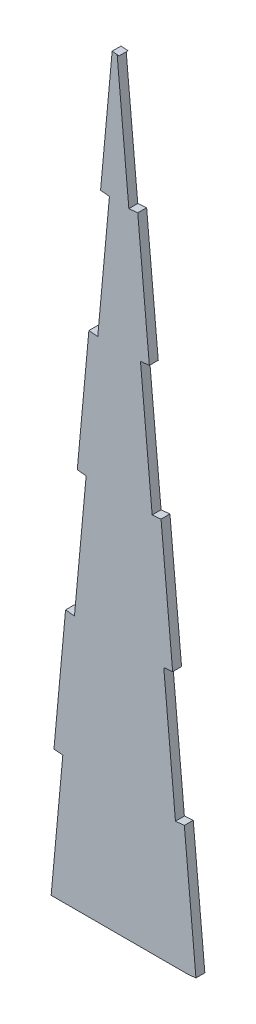
ISO-10303-21;
HEADER;
FILE_DESCRIPTION(('STEP AP214'),'2;1');
FILE_NAME('part.step','',(''),(''),'','','');
FILE_SCHEMA(('AUTOMOTIVE_DESIGN { 1 0 10303 214 1 1 1 1 }'));
ENDSEC;
DATA;
#1=APPLICATION_CONTEXT('core data for automotive mechanical design processes');
#2=APPLICATION_PROTOCOL_DEFINITION('international standard','automotive_design',2000,#1);
#3=PRODUCT_CONTEXT('',#1,'mechanical');
#4=PRODUCT('Part','Part','',(#3));
#5=PRODUCT_RELATED_PRODUCT_CATEGORY('part','',(#4));
#6=PRODUCT_DEFINITION_FORMATION('','',#4);
#7=PRODUCT_DEFINITION_CONTEXT('part definition',#1,'design');
#8=PRODUCT_DEFINITION('design','',#6,#7);
#9=PRODUCT_DEFINITION_SHAPE('','',#8);
#10=(LENGTH_UNIT() NAMED_UNIT(*) SI_UNIT(.MILLI.,.METRE.));
#11=(NAMED_UNIT(*) PLANE_ANGLE_UNIT() SI_UNIT($,.RADIAN.));
#12=(NAMED_UNIT(*) SI_UNIT($,.STERADIAN.) SOLID_ANGLE_UNIT());
#13=UNCERTAINTY_MEASURE_WITH_UNIT(LENGTH_MEASURE(1.E-05),#10,'distance_accuracy_value','');
#14=(GEOMETRIC_REPRESENTATION_CONTEXT(3) GLOBAL_UNCERTAINTY_ASSIGNED_CONTEXT((#13)) GLOBAL_UNIT_ASSIGNED_CONTEXT((#10,
#11,#12)) REPRESENTATION_CONTEXT('',''));
#15=CARTESIAN_POINT('',(0.,0.,0.));
#16=DIRECTION('',(0.,0.,1.));
#17=DIRECTION('',(1.,0.,0.));
#18=AXIS2_PLACEMENT_3D('',#15,#16,#17);
#19=CARTESIAN_POINT('',(0.,0.,3.));
#20=DIRECTION('',(0.,-1.,0.));
#21=DIRECTION('',(1.,0.,0.));
#22=AXIS2_PLACEMENT_3D('',#19,#20,#21);
#23=PLANE('',#22);
#24=DIRECTION('',(-1.,0.,0.));
#25=VECTOR('',#24,1.);
#26=CARTESIAN_POINT('',(0.,0.,0.));
#27=LINE('',#26,#25);
#28=CARTESIAN_POINT('',(22.8754046658497,0.,0.));
#29=VERTEX_POINT('',#28);
#30=CARTESIAN_POINT('',(-22.8754046658497,0.,0.));
#31=VERTEX_POINT('',#30);
#32=EDGE_CURVE('E248',#29,#31,#27,.T.);
#33=ORIENTED_EDGE('',*,*,#32,.F.);
#34=DIRECTION('',(0.,0.,-1.));
#35=VECTOR('',#34,1.);
#36=CARTESIAN_POINT('',(22.8754046658497,0.,3.));
#37=LINE('',#36,#35);
#38=CARTESIAN_POINT('',(22.8754046658497,0.,3.));
#39=VERTEX_POINT('',#38);
#40=EDGE_CURVE('E11',#39,#29,#37,.T.);
#41=ORIENTED_EDGE('',*,*,#40,.F.);
#42=DIRECTION('',(-1.,0.,0.));
#43=VECTOR('',#42,1.);
#44=CARTESIAN_POINT('',(0.,0.,3.));
#45=LINE('',#44,#43);
#46=CARTESIAN_POINT('',(-22.8754046658497,0.,3.));
#47=VERTEX_POINT('',#46);
#48=EDGE_CURVE('E348',#39,#47,#45,.T.);
#49=ORIENTED_EDGE('',*,*,#48,.T.);
#50=DIRECTION('',(0.,0.,-1.));
#51=VECTOR('',#50,1.);
#52=CARTESIAN_POINT('',(-22.8754046658497,0.,3.));
#53=LINE('',#52,#51);
#54=EDGE_CURVE('E58',#47,#31,#53,.T.);
#55=ORIENTED_EDGE('',*,*,#54,.T.);
#56=EDGE_LOOP('',(#33,#41,#49,#55));
#57=FACE_BOUND('',#56,.T.);
#58=ADVANCED_FACE('F41',(#57),#23,.T.);
#59=CARTESIAN_POINT('',(0.191525382826554,-2.08435569509437,3.));
#60=DIRECTION('',(-0.0915016186647774,0.995804927574535,0.));
#61=DIRECTION('',(-0.995804927574535,-0.0915016186647774,0.));
#62=AXIS2_PLACEMENT_3D('',#59,#60,#61);
#63=PLANE('',#62);
#64=DIRECTION('',(0.995804927574535,0.0915016186647774,0.));
#65=VECTOR('',#64,1.);
#66=CARTESIAN_POINT('',(0.191525382826554,-2.08435569509437,0.));
#67=LINE('',#66,#65);
#68=CARTESIAN_POINT('',(25.8628194485877,0.274504855995672,0.));
#69=VERTEX_POINT('',#68);
#70=EDGE_CURVE('E251',#29,#69,#67,.T.);
#71=ORIENTED_EDGE('',*,*,#70,.T.);
#72=DIRECTION('',(0.,0.,-1.));
#73=VECTOR('',#72,1.);
#74=CARTESIAN_POINT('',(25.8628194485877,0.274504855995672,3.));
#75=LINE('',#74,#73);
#76=CARTESIAN_POINT('',(25.8628194485877,0.274504855995672,3.));
#77=VERTEX_POINT('',#76);
#78=EDGE_CURVE('E50',#77,#69,#75,.T.);
#79=ORIENTED_EDGE('',*,*,#78,.F.);
#80=DIRECTION('',(0.995804927574535,0.0915016186647774,0.));
#81=VECTOR('',#80,1.);
#82=CARTESIAN_POINT('',(0.191525382826554,-2.08435569509437,3.));
#83=LINE('',#82,#81);
#84=EDGE_CURVE('E436',#39,#77,#83,.T.);
#85=ORIENTED_EDGE('',*,*,#84,.F.);
#86=ORIENTED_EDGE('',*,*,#40,.T.);
#87=EDGE_LOOP('',(#71,#79,#85,#86));
#88=FACE_BOUND('',#87,.T.);
#89=ADVANCED_FACE('F424',(#88),#63,.F.);
#90=CARTESIAN_POINT('',(25.6712940657672,2.35886055105531,3.));
#91=DIRECTION('',(0.99580492757466,0.0915016186634203,0.));
#92=DIRECTION('',(-0.0915016186634203,0.99580492757466,0.));
#93=AXIS2_PLACEMENT_3D('',#90,#91,#92);
#94=PLANE('',#93);
#95=DIRECTION('',(0.0915016186634204,-0.99580492757466,0.));
#96=VECTOR('',#95,1.);
#97=CARTESIAN_POINT('',(25.6712940657672,2.35886055105531,0.));
#98=LINE('',#97,#96);
#99=CARTESIAN_POINT('',(21.9550467486692,42.8024881557735,0.));
#100=VERTEX_POINT('',#99);
#101=EDGE_CURVE('E255',#100,#69,#98,.T.);
#102=ORIENTED_EDGE('',*,*,#101,.F.);
#103=DIRECTION('',(0.,0.,-1.));
#104=VECTOR('',#103,1.);
#105=CARTESIAN_POINT('',(21.9550467486692,42.8024881557735,3.));
#106=LINE('',#105,#104);
#107=CARTESIAN_POINT('',(21.9550467486692,42.8024881557735,3.));
#108=VERTEX_POINT('',#107);
#109=EDGE_CURVE('E412',#108,#100,#106,.T.);
#110=ORIENTED_EDGE('',*,*,#109,.F.);
#111=DIRECTION('',(0.0915016186634204,-0.99580492757466,0.));
#112=VECTOR('',#111,1.);
#113=CARTESIAN_POINT('',(25.6712940657672,2.35886055105531,3.));
#114=LINE('',#113,#112);
#115=EDGE_CURVE('E421',#108,#77,#114,.T.);
#116=ORIENTED_EDGE('',*,*,#115,.T.);
#117=ORIENTED_EDGE('',*,*,#78,.T.);
#118=EDGE_LOOP('',(#102,#110,#116,#117));
#119=FACE_BOUND('',#118,.T.);
#120=ADVANCED_FACE('F419',(#119),#94,.T.);
#121=CARTESIAN_POINT('',(-3.71624731709802,40.4436276047182,3.));
#122=DIRECTION('',(-0.0915016186634206,0.99580492757466,0.));
#123=DIRECTION('',(-0.99580492757466,-0.0915016186634206,0.));
#124=AXIS2_PLACEMENT_3D('',#121,#122,#123);
#125=PLANE('',#124);
#126=DIRECTION('',(0.99580492757466,0.0915016186634206,0.));
#127=VECTOR('',#126,1.);
#128=CARTESIAN_POINT('',(-3.71624731709802,40.4436276047182,0.));
#129=LINE('',#128,#127);
#130=CARTESIAN_POINT('',(18.9676319659327,42.5279832997821,0.));
#131=VERTEX_POINT('',#130);
#132=EDGE_CURVE('E259',#131,#100,#129,.T.);
#133=ORIENTED_EDGE('',*,*,#132,.F.);
#134=DIRECTION('',(0.,0.,-1.));
#135=VECTOR('',#134,1.);
#136=CARTESIAN_POINT('',(18.9676319659327,42.5279832997821,3.));
#137=LINE('',#136,#135);
#138=CARTESIAN_POINT('',(18.9676319659327,42.5279832997821,3.));
#139=VERTEX_POINT('',#138);
#140=EDGE_CURVE('E409',#139,#131,#137,.T.);
#141=ORIENTED_EDGE('',*,*,#140,.F.);
#142=DIRECTION('',(0.99580492757466,0.0915016186634206,0.));
#143=VECTOR('',#142,1.);
#144=CARTESIAN_POINT('',(-3.71624731709802,40.4436276047182,3.));
#145=LINE('',#144,#143);
#146=EDGE_CURVE('E433',#139,#108,#145,.T.);
#147=ORIENTED_EDGE('',*,*,#146,.T.);
#148=ORIENTED_EDGE('',*,*,#109,.T.);
#149=EDGE_LOOP('',(#133,#141,#147,#148));
#150=FACE_BOUND('',#149,.T.);
#151=ADVANCED_FACE('F430',(#150),#125,.T.);
#152=CARTESIAN_POINT('',(22.6838792830308,2.08435569506391,3.));
#153=DIRECTION('',(0.99580492757466,0.0915016186634205,0.));
#154=DIRECTION('',(-0.0915016186634205,0.99580492757466,0.));
#155=AXIS2_PLACEMENT_3D('',#152,#153,#154);
#156=PLANE('',#155);
#157=DIRECTION('',(0.0915016186634205,-0.99580492757466,0.));
#158=VECTOR('',#157,1.);
#159=CARTESIAN_POINT('',(22.6838792830308,2.08435569506391,0.));
#160=LINE('',#159,#158);
#161=CARTESIAN_POINT('',(15.0324087804152,85.3547080778323,0.));
#162=VERTEX_POINT('',#161);
#163=EDGE_CURVE('E263',#162,#131,#160,.T.);
#164=ORIENTED_EDGE('',*,*,#163,.F.);
#165=DIRECTION('',(0.,0.,-1.));
#166=VECTOR('',#165,1.);
#167=CARTESIAN_POINT('',(15.0324087804152,85.3547080778323,3.));
#168=LINE('',#167,#166);
#169=CARTESIAN_POINT('',(15.0324087804152,85.3547080778323,3.));
#170=VERTEX_POINT('',#169);
#171=EDGE_CURVE('E406',#170,#162,#168,.T.);
#172=ORIENTED_EDGE('',*,*,#171,.F.);
#173=DIRECTION('',(0.0915016186634205,-0.99580492757466,0.));
#174=VECTOR('',#173,1.);
#175=CARTESIAN_POINT('',(22.6838792830308,2.08435569506391,3.));
#176=LINE('',#175,#174);
#177=EDGE_CURVE('E441',#170,#139,#176,.T.);
#178=ORIENTED_EDGE('',*,*,#177,.T.);
#179=ORIENTED_EDGE('',*,*,#140,.T.);
#180=EDGE_LOOP('',(#164,#172,#178,#179));
#181=FACE_BOUND('',#180,.T.);
#182=ADVANCED_FACE('F541',(#181),#156,.T.);
#183=CARTESIAN_POINT('',(-7.65147050261588,83.2703523827683,3.));
#184=DIRECTION('',(0.0915016186634246,-0.99580492757466,0.));
#185=DIRECTION('',(0.99580492757466,0.0915016186634246,0.));
#186=AXIS2_PLACEMENT_3D('',#183,#184,#185);
#187=PLANE('',#186);
#188=DIRECTION('',(-0.99580492757466,-0.0915016186634246,0.));
#189=VECTOR('',#188,1.);
#190=CARTESIAN_POINT('',(-7.65147050261588,83.2703523827683,0.));
#191=LINE('',#190,#189);
#192=CARTESIAN_POINT('',(18.0198235631517,85.6292129338238,0.));
#193=VERTEX_POINT('',#192);
#194=EDGE_CURVE('E267',#193,#162,#191,.T.);
#195=ORIENTED_EDGE('',*,*,#194,.F.);
#196=DIRECTION('',(0.,0.,-1.));
#197=VECTOR('',#196,1.);
#198=CARTESIAN_POINT('',(18.0198235631517,85.6292129338238,3.));
#199=LINE('',#198,#197);
#200=CARTESIAN_POINT('',(18.0198235631517,85.6292129338238,3.));
#201=VERTEX_POINT('',#200);
#202=EDGE_CURVE('E403',#201,#193,#199,.T.);
#203=ORIENTED_EDGE('',*,*,#202,.F.);
#204=DIRECTION('',(-0.99580492757466,-0.0915016186634246,0.));
#205=VECTOR('',#204,1.);
#206=CARTESIAN_POINT('',(-7.65147050261588,83.2703523827683,3.));
#207=LINE('',#206,#205);
#208=EDGE_CURVE('E448',#201,#170,#207,.T.);
#209=ORIENTED_EDGE('',*,*,#208,.T.);
#210=ORIENTED_EDGE('',*,*,#171,.T.);
#211=EDGE_LOOP('',(#195,#203,#209,#210));
#212=FACE_BOUND('',#211,.T.);
#213=ADVANCED_FACE('F544',(#212),#187,.T.);
#214=CARTESIAN_POINT('',(25.6712940657672,2.35886055105531,3.));
#215=DIRECTION('',(0.99580492757466,0.0915016186634201,0.));
#216=DIRECTION('',(-0.0915016186634201,0.99580492757466,0.));
#217=AXIS2_PLACEMENT_3D('',#214,#215,#216);
#218=PLANE('',#217);
#219=DIRECTION('',(0.0915016186634201,-0.99580492757466,0.));
#220=VECTOR('',#219,1.);
#221=CARTESIAN_POINT('',(25.6712940657672,2.35886055105531,0.));
#222=LINE('',#221,#220);
#223=CARTESIAN_POINT('',(14.1120508632332,128.157196233602,0.));
#224=VERTEX_POINT('',#223);
#225=EDGE_CURVE('E271',#224,#193,#222,.T.);
#226=ORIENTED_EDGE('',*,*,#225,.F.);
#227=DIRECTION('',(0.,0.,-1.));
#228=VECTOR('',#227,1.);
#229=CARTESIAN_POINT('',(14.1120508632332,128.157196233602,3.));
#230=LINE('',#229,#228);
#231=CARTESIAN_POINT('',(14.1120508632332,128.157196233602,3.));
#232=VERTEX_POINT('',#231);
#233=EDGE_CURVE('E400',#232,#224,#230,.T.);
#234=ORIENTED_EDGE('',*,*,#233,.F.);
#235=DIRECTION('',(0.0915016186634201,-0.99580492757466,0.));
#236=VECTOR('',#235,1.);
#237=CARTESIAN_POINT('',(25.6712940657672,2.35886055105531,3.));
#238=LINE('',#237,#236);
#239=EDGE_CURVE('E452',#232,#201,#238,.T.);
#240=ORIENTED_EDGE('',*,*,#239,.T.);
#241=ORIENTED_EDGE('',*,*,#202,.T.);
#242=EDGE_LOOP('',(#226,#234,#240,#241));
#243=FACE_BOUND('',#242,.T.);
#244=ADVANCED_FACE('F548',(#243),#218,.T.);
#245=CARTESIAN_POINT('',(-11.5592432025335,125.798335682546,3.));
#246=DIRECTION('',(-0.0915016186634158,0.99580492757466,0.));
#247=DIRECTION('',(-0.995804927574661,-0.0915016186634158,0.));
#248=AXIS2_PLACEMENT_3D('',#245,#246,#247);
#249=PLANE('',#248);
#250=DIRECTION('',(0.995804927574661,0.0915016186634158,0.));
#251=VECTOR('',#250,1.);
#252=CARTESIAN_POINT('',(-11.5592432025335,125.798335682546,0.));
#253=LINE('',#252,#251);
#254=CARTESIAN_POINT('',(11.1246360804967,127.88269137761,0.));
#255=VERTEX_POINT('',#254);
#256=EDGE_CURVE('E275',#255,#224,#253,.T.);
#257=ORIENTED_EDGE('',*,*,#256,.F.);
#258=DIRECTION('',(0.,0.,-1.));
#259=VECTOR('',#258,1.);
#260=CARTESIAN_POINT('',(11.1246360804967,127.88269137761,3.));
#261=LINE('',#260,#259);
#262=CARTESIAN_POINT('',(11.1246360804967,127.88269137761,3.));
#263=VERTEX_POINT('',#262);
#264=EDGE_CURVE('E397',#263,#255,#261,.T.);
#265=ORIENTED_EDGE('',*,*,#264,.F.);
#266=DIRECTION('',(0.995804927574661,0.0915016186634158,0.));
#267=VECTOR('',#266,1.);
#268=CARTESIAN_POINT('',(-11.5592432025335,125.798335682546,3.));
#269=LINE('',#268,#267);
#270=EDGE_CURVE('E456',#263,#232,#269,.T.);
#271=ORIENTED_EDGE('',*,*,#270,.T.);
#272=ORIENTED_EDGE('',*,*,#233,.T.);
#273=EDGE_LOOP('',(#257,#265,#271,#272));
#274=FACE_BOUND('',#273,.T.);
#275=ADVANCED_FACE('F552',(#274),#249,.T.);
#276=CARTESIAN_POINT('',(22.6838792830308,2.08435569506391,3.));
#277=DIRECTION('',(0.99580492757466,0.0915016186634204,0.));
#278=DIRECTION('',(-0.0915016186634204,0.99580492757466,0.));
#279=AXIS2_PLACEMENT_3D('',#276,#277,#278);
#280=PLANE('',#279);
#281=DIRECTION('',(0.0915016186634204,-0.99580492757466,0.));
#282=VECTOR('',#281,1.);
#283=CARTESIAN_POINT('',(22.6838792830308,2.08435569506391,0.));
#284=LINE('',#283,#282);
#285=CARTESIAN_POINT('',(7.1894128949792,170.70941615566,0.));
#286=VERTEX_POINT('',#285);
#287=EDGE_CURVE('E279',#286,#255,#284,.T.);
#288=ORIENTED_EDGE('',*,*,#287,.F.);
#289=DIRECTION('',(0.,0.,-1.));
#290=VECTOR('',#289,1.);
#291=CARTESIAN_POINT('',(7.1894128949792,170.70941615566,3.));
#292=LINE('',#291,#290);
#293=CARTESIAN_POINT('',(7.1894128949792,170.70941615566,3.));
#294=VERTEX_POINT('',#293);
#295=EDGE_CURVE('E394',#294,#286,#292,.T.);
#296=ORIENTED_EDGE('',*,*,#295,.F.);
#297=DIRECTION('',(0.0915016186634204,-0.99580492757466,0.));
#298=VECTOR('',#297,1.);
#299=CARTESIAN_POINT('',(22.6838792830308,2.08435569506391,3.));
#300=LINE('',#299,#298);
#301=EDGE_CURVE('E460',#294,#263,#300,.T.);
#302=ORIENTED_EDGE('',*,*,#301,.T.);
#303=ORIENTED_EDGE('',*,*,#264,.T.);
#304=EDGE_LOOP('',(#288,#296,#302,#303));
#305=FACE_BOUND('',#304,.T.);
#306=ADVANCED_FACE('F556',(#305),#280,.T.);
#307=CARTESIAN_POINT('',(-15.4944663880538,168.625060460596,3.));
#308=DIRECTION('',(0.0915016186634336,-0.995804927574659,0.));
#309=DIRECTION('',(0.995804927574659,0.0915016186634337,0.));
#310=AXIS2_PLACEMENT_3D('',#307,#308,#309);
#311=PLANE('',#310);
#312=DIRECTION('',(-0.995804927574659,-0.0915016186634336,0.));
#313=VECTOR('',#312,1.);
#314=CARTESIAN_POINT('',(-15.4944663880538,168.625060460596,0.));
#315=LINE('',#314,#313);
#316=CARTESIAN_POINT('',(10.1768276777157,170.983921011652,0.));
#317=VERTEX_POINT('',#316);
#318=EDGE_CURVE('E283',#317,#286,#315,.T.);
#319=ORIENTED_EDGE('',*,*,#318,.F.);
#320=DIRECTION('',(0.,0.,-1.));
#321=VECTOR('',#320,1.);
#322=CARTESIAN_POINT('',(10.1768276777157,170.983921011652,3.));
#323=LINE('',#322,#321);
#324=CARTESIAN_POINT('',(10.1768276777157,170.983921011652,3.));
#325=VERTEX_POINT('',#324);
#326=EDGE_CURVE('E391',#325,#317,#323,.T.);
#327=ORIENTED_EDGE('',*,*,#326,.F.);
#328=DIRECTION('',(-0.995804927574659,-0.0915016186634336,0.));
#329=VECTOR('',#328,1.);
#330=CARTESIAN_POINT('',(-15.4944663880538,168.625060460596,3.));
#331=LINE('',#330,#329);
#332=EDGE_CURVE('E464',#325,#294,#331,.T.);
#333=ORIENTED_EDGE('',*,*,#332,.T.);
#334=ORIENTED_EDGE('',*,*,#295,.T.);
#335=EDGE_LOOP('',(#319,#327,#333,#334));
#336=FACE_BOUND('',#335,.T.);
#337=ADVANCED_FACE('F560',(#336),#311,.T.);
#338=CARTESIAN_POINT('',(25.6712940657673,2.35886055105532,3.));
#339=DIRECTION('',(0.99580492757466,0.0915016186634203,0.));
#340=DIRECTION('',(-0.0915016186634203,0.99580492757466,0.));
#341=AXIS2_PLACEMENT_3D('',#338,#339,#340);
#342=PLANE('',#341);
#343=DIRECTION('',(0.0915016186634203,-0.99580492757466,0.));
#344=VECTOR('',#343,1.);
#345=CARTESIAN_POINT('',(25.6712940657673,2.35886055105532,0.));
#346=LINE('',#345,#344);
#347=CARTESIAN_POINT('',(6.26905497779721,213.51190431143,0.));
#348=VERTEX_POINT('',#347);
#349=EDGE_CURVE('E287',#348,#317,#346,.T.);
#350=ORIENTED_EDGE('',*,*,#349,.F.);
#351=DIRECTION('',(0.,0.,-1.));
#352=VECTOR('',#351,1.);
#353=CARTESIAN_POINT('',(6.26905497779721,213.51190431143,3.));
#354=LINE('',#353,#352);
#355=CARTESIAN_POINT('',(6.26905497779721,213.51190431143,3.));
#356=VERTEX_POINT('',#355);
#357=EDGE_CURVE('E388',#356,#348,#354,.T.);
#358=ORIENTED_EDGE('',*,*,#357,.F.);
#359=DIRECTION('',(0.0915016186634203,-0.99580492757466,0.));
#360=VECTOR('',#359,1.);
#361=CARTESIAN_POINT('',(25.6712940657673,2.35886055105532,3.));
#362=LINE('',#361,#360);
#363=EDGE_CURVE('E468',#356,#325,#362,.T.);
#364=ORIENTED_EDGE('',*,*,#363,.T.);
#365=ORIENTED_EDGE('',*,*,#326,.T.);
#366=EDGE_LOOP('',(#350,#358,#364,#365));
#367=FACE_BOUND('',#366,.T.);
#368=ADVANCED_FACE('F564',(#367),#342,.T.);
#369=CARTESIAN_POINT('',(-19.4022390879729,211.153043760374,3.));
#370=DIRECTION('',(-0.0915016186634338,0.995804927574659,0.));
#371=DIRECTION('',(-0.995804927574659,-0.0915016186634338,0.));
#372=AXIS2_PLACEMENT_3D('',#369,#370,#371);
#373=PLANE('',#372);
#374=DIRECTION('',(0.995804927574659,0.0915016186634338,0.));
#375=VECTOR('',#374,1.);
#376=CARTESIAN_POINT('',(-19.4022390879729,211.153043760374,0.));
#377=LINE('',#376,#375);
#378=CARTESIAN_POINT('',(3.2816401950607,213.237399455438,0.));
#379=VERTEX_POINT('',#378);
#380=EDGE_CURVE('E291',#379,#348,#377,.T.);
#381=ORIENTED_EDGE('',*,*,#380,.F.);
#382=DIRECTION('',(0.,0.,-1.));
#383=VECTOR('',#382,1.);
#384=CARTESIAN_POINT('',(3.2816401950607,213.237399455438,3.));
#385=LINE('',#384,#383);
#386=CARTESIAN_POINT('',(3.2816401950607,213.237399455438,3.));
#387=VERTEX_POINT('',#386);
#388=EDGE_CURVE('E385',#387,#379,#385,.T.);
#389=ORIENTED_EDGE('',*,*,#388,.F.);
#390=DIRECTION('',(0.995804927574659,0.0915016186634338,0.));
#391=VECTOR('',#390,1.);
#392=CARTESIAN_POINT('',(-19.4022390879729,211.153043760374,3.));
#393=LINE('',#392,#391);
#394=EDGE_CURVE('E472',#387,#356,#393,.T.);
#395=ORIENTED_EDGE('',*,*,#394,.T.);
#396=ORIENTED_EDGE('',*,*,#357,.T.);
#397=EDGE_LOOP('',(#381,#389,#395,#396));
#398=FACE_BOUND('',#397,.T.);
#399=ADVANCED_FACE('F568',(#398),#373,.T.);
#400=CARTESIAN_POINT('',(22.6838792830308,2.08435569506391,3.));
#401=DIRECTION('',(0.99580492757466,0.0915016186634204,0.));
#402=DIRECTION('',(-0.0915016186634204,0.99580492757466,0.));
#403=AXIS2_PLACEMENT_3D('',#400,#401,#402);
#404=PLANE('',#403);
#405=DIRECTION('',(0.0915016186634204,-0.99580492757466,0.));
#406=VECTOR('',#405,1.);
#407=CARTESIAN_POINT('',(22.6838792830308,2.08435569506391,0.));
#408=LINE('',#407,#406);
#409=CARTESIAN_POINT('',(-0.653582990456831,256.064124233489,0.));
#410=VERTEX_POINT('',#409);
#411=EDGE_CURVE('E295',#410,#379,#408,.T.);
#412=ORIENTED_EDGE('',*,*,#411,.F.);
#413=DIRECTION('',(0.,0.,-1.));
#414=VECTOR('',#413,1.);
#415=CARTESIAN_POINT('',(-0.653582990456831,256.064124233489,3.));
#416=LINE('',#415,#414);
#417=CARTESIAN_POINT('',(-0.653582990456831,256.064124233489,3.));
#418=VERTEX_POINT('',#417);
#419=EDGE_CURVE('E382',#418,#410,#416,.T.);
#420=ORIENTED_EDGE('',*,*,#419,.F.);
#421=DIRECTION('',(0.0915016186634204,-0.99580492757466,0.));
#422=VECTOR('',#421,1.);
#423=CARTESIAN_POINT('',(22.6838792830308,2.08435569506391,3.));
#424=LINE('',#423,#422);
#425=EDGE_CURVE('E476',#418,#387,#424,.T.);
#426=ORIENTED_EDGE('',*,*,#425,.T.);
#427=ORIENTED_EDGE('',*,*,#388,.T.);
#428=EDGE_LOOP('',(#412,#420,#426,#427));
#429=FACE_BOUND('',#428,.T.);
#430=ADVANCED_FACE('F572',(#429),#404,.T.);
#431=CARTESIAN_POINT('',(-23.337462273491,253.979768538424,3.));
#432=DIRECTION('',(0.0915016186634336,-0.995804927574659,0.));
#433=DIRECTION('',(0.995804927574659,0.0915016186634336,0.));
#434=AXIS2_PLACEMENT_3D('',#431,#432,#433);
#435=PLANE('',#434);
#436=DIRECTION('',(-0.995804927574659,-0.0915016186634336,0.));
#437=VECTOR('',#436,1.);
#438=CARTESIAN_POINT('',(-23.337462273491,253.979768538424,0.));
#439=LINE('',#438,#437);
#440=CARTESIAN_POINT('',(2.13457723718946E-11,256.124180073647,0.));
#441=VERTEX_POINT('',#440);
#442=EDGE_CURVE('E299',#441,#410,#439,.T.);
#443=ORIENTED_EDGE('',*,*,#442,.F.);
#444=DIRECTION('',(0.,0.,-1.));
#445=VECTOR('',#444,1.);
#446=CARTESIAN_POINT('',(2.13457723718946E-11,256.124180073647,3.));
#447=LINE('',#446,#445);
#448=CARTESIAN_POINT('',(2.13457723718946E-11,256.124180073647,3.));
#449=VERTEX_POINT('',#448);
#450=EDGE_CURVE('E379',#449,#441,#447,.T.);
#451=ORIENTED_EDGE('',*,*,#450,.F.);
#452=DIRECTION('',(-0.995804927574659,-0.0915016186634336,0.));
#453=VECTOR('',#452,1.);
#454=CARTESIAN_POINT('',(-23.337462273491,253.979768538424,3.));
#455=LINE('',#454,#453);
#456=EDGE_CURVE('E480',#449,#418,#455,.T.);
#457=ORIENTED_EDGE('',*,*,#456,.T.);
#458=ORIENTED_EDGE('',*,*,#419,.T.);
#459=EDGE_LOOP('',(#443,#451,#457,#458));
#460=FACE_BOUND('',#459,.T.);
#461=ADVANCED_FACE('F576',(#460),#435,.T.);
#462=CARTESIAN_POINT('',(23.3374622734774,253.97976853843,3.));
#463=DIRECTION('',(0.0915016186633786,0.995804927574664,0.));
#464=DIRECTION('',(-0.995804927574664,0.0915016186633786,0.));
#465=AXIS2_PLACEMENT_3D('',#462,#463,#464);
#466=PLANE('',#465);
#467=DIRECTION('',(0.995804927574664,-0.0915016186633786,0.));
#468=VECTOR('',#467,1.);
#469=CARTESIAN_POINT('',(23.3374622734774,253.97976853843,0.));
#470=LINE('',#469,#468);
#471=CARTESIAN_POINT('',(-2.3338317922829,256.338629089484,0.));
#472=VERTEX_POINT('',#471);
#473=EDGE_CURVE('E303',#472,#441,#470,.T.);
#474=ORIENTED_EDGE('',*,*,#473,.F.);
#475=DIRECTION('',(0.,0.,-1.));
#476=VECTOR('',#475,1.);
#477=CARTESIAN_POINT('',(-2.3338317922829,256.338629089484,3.));
#478=LINE('',#477,#476);
#479=CARTESIAN_POINT('',(-2.3338317922829,256.338629089484,3.));
#480=VERTEX_POINT('',#479);
#481=EDGE_CURVE('E376',#480,#472,#478,.T.);
#482=ORIENTED_EDGE('',*,*,#481,.F.);
#483=DIRECTION('',(0.995804927574664,-0.0915016186633786,0.));
#484=VECTOR('',#483,1.);
#485=CARTESIAN_POINT('',(23.3374622734774,253.97976853843,3.));
#486=LINE('',#485,#484);
#487=EDGE_CURVE('E484',#480,#449,#486,.T.);
#488=ORIENTED_EDGE('',*,*,#487,.T.);
#489=ORIENTED_EDGE('',*,*,#450,.T.);
#490=EDGE_LOOP('',(#474,#482,#488,#489));
#491=FACE_BOUND('',#490,.T.);
#492=ADVANCED_FACE('F580',(#491),#466,.T.);
#493=CARTESIAN_POINT('',(-25.6712940657657,2.35886055105464,3.));
#494=DIRECTION('',(-0.995804927574662,0.0915016186633999,0.));
#495=DIRECTION('',(-0.0915016186633999,-0.995804927574662,0.));
#496=AXIS2_PLACEMENT_3D('',#493,#494,#495);
#497=PLANE('',#496);
#498=DIRECTION('',(0.0915016186633999,0.995804927574662,0.));
#499=VECTOR('',#498,1.);
#500=CARTESIAN_POINT('',(-25.6712940657657,2.35886055105464,0.));
#501=LINE('',#500,#499);
#502=CARTESIAN_POINT('',(-6.24160449220052,213.810645789706,0.));
#503=VERTEX_POINT('',#502);
#504=EDGE_CURVE('E307',#503,#472,#501,.T.);
#505=ORIENTED_EDGE('',*,*,#504,.F.);
#506=DIRECTION('',(0.,0.,-1.));
#507=VECTOR('',#506,1.);
#508=CARTESIAN_POINT('',(-6.24160449220052,213.810645789706,3.));
#509=LINE('',#508,#507);
#510=CARTESIAN_POINT('',(-6.24160449220052,213.810645789706,3.));
#511=VERTEX_POINT('',#510);
#512=EDGE_CURVE('E373',#511,#503,#509,.T.);
#513=ORIENTED_EDGE('',*,*,#512,.F.);
#514=DIRECTION('',(0.0915016186633999,0.995804927574662,0.));
#515=VECTOR('',#514,1.);
#516=CARTESIAN_POINT('',(-25.6712940657657,2.35886055105464,3.));
#517=LINE('',#516,#515);
#518=EDGE_CURVE('E488',#511,#480,#517,.T.);
#519=ORIENTED_EDGE('',*,*,#518,.T.);
#520=ORIENTED_EDGE('',*,*,#481,.T.);
#521=EDGE_LOOP('',(#505,#513,#519,#520));
#522=FACE_BOUND('',#521,.T.);
#523=ADVANCED_FACE('F584',(#522),#497,.T.);
#524=CARTESIAN_POINT('',(19.4296895735704,211.451785238651,3.));
#525=DIRECTION('',(-0.0915016186634246,-0.99580492757466,0.));
#526=DIRECTION('',(0.99580492757466,-0.0915016186634246,0.));
#527=AXIS2_PLACEMENT_3D('',#524,#525,#526);
#528=PLANE('',#527);
#529=DIRECTION('',(-0.99580492757466,0.0915016186634246,0.));
#530=VECTOR('',#529,1.);
#531=CARTESIAN_POINT('',(19.4296895735704,211.451785238651,0.));
#532=LINE('',#531,#530);
#533=CARTESIAN_POINT('',(-3.254189709464,213.536140933715,0.));
#534=VERTEX_POINT('',#533);
#535=EDGE_CURVE('E311',#534,#503,#532,.T.);
#536=ORIENTED_EDGE('',*,*,#535,.F.);
#537=DIRECTION('',(0.,0.,-1.));
#538=VECTOR('',#537,1.);
#539=CARTESIAN_POINT('',(-3.254189709464,213.536140933715,3.));
#540=LINE('',#539,#538);
#541=CARTESIAN_POINT('',(-3.254189709464,213.536140933715,3.));
#542=VERTEX_POINT('',#541);
#543=EDGE_CURVE('E370',#542,#534,#540,.T.);
#544=ORIENTED_EDGE('',*,*,#543,.F.);
#545=DIRECTION('',(-0.99580492757466,0.0915016186634246,0.));
#546=VECTOR('',#545,1.);
#547=CARTESIAN_POINT('',(19.4296895735704,211.451785238651,3.));
#548=LINE('',#547,#546);
#549=EDGE_CURVE('E492',#542,#511,#548,.T.);
#550=ORIENTED_EDGE('',*,*,#549,.T.);
#551=ORIENTED_EDGE('',*,*,#512,.T.);
#552=EDGE_LOOP('',(#536,#544,#550,#551));
#553=FACE_BOUND('',#552,.T.);
#554=ADVANCED_FACE('F588',(#553),#528,.T.);
#555=CARTESIAN_POINT('',(-22.6838792830291,2.08435569506328,3.));
#556=DIRECTION('',(-0.995804927574662,0.0915016186633997,0.));
#557=DIRECTION('',(-0.0915016186633997,-0.995804927574662,0.));
#558=AXIS2_PLACEMENT_3D('',#555,#556,#557);
#559=PLANE('',#558);
#560=DIRECTION('',(0.0915016186633997,0.995804927574662,0.));
#561=VECTOR('',#560,1.);
#562=CARTESIAN_POINT('',(-22.6838792830291,2.08435569506328,0.));
#563=LINE('',#562,#561);
#564=CARTESIAN_POINT('',(-7.18941289498064,170.709416155665,0.));
#565=VERTEX_POINT('',#564);
#566=EDGE_CURVE('E315',#565,#534,#563,.T.);
#567=ORIENTED_EDGE('',*,*,#566,.F.);
#568=DIRECTION('',(0.,0.,-1.));
#569=VECTOR('',#568,1.);
#570=CARTESIAN_POINT('',(-7.18941289498064,170.709416155665,3.));
#571=LINE('',#570,#569);
#572=CARTESIAN_POINT('',(-7.18941289498064,170.709416155665,3.));
#573=VERTEX_POINT('',#572);
#574=EDGE_CURVE('E367',#573,#565,#571,.T.);
#575=ORIENTED_EDGE('',*,*,#574,.F.);
#576=DIRECTION('',(0.0915016186633997,0.995804927574662,0.));
#577=VECTOR('',#576,1.);
#578=CARTESIAN_POINT('',(-22.6838792830291,2.08435569506328,3.));
#579=LINE('',#578,#577);
#580=EDGE_CURVE('E496',#573,#542,#579,.T.);
#581=ORIENTED_EDGE('',*,*,#580,.T.);
#582=ORIENTED_EDGE('',*,*,#543,.T.);
#583=EDGE_LOOP('',(#567,#575,#581,#582));
#584=FACE_BOUND('',#583,.T.);
#585=ADVANCED_FACE('F592',(#584),#559,.T.);
#586=CARTESIAN_POINT('',(15.4944663880465,168.625060460602,3.));
#587=DIRECTION('',(0.091501618663388,0.995804927574663,0.));
#588=DIRECTION('',(-0.995804927574663,0.091501618663388,0.));
#589=AXIS2_PLACEMENT_3D('',#586,#587,#588);
#590=PLANE('',#589);
#591=DIRECTION('',(0.995804927574663,-0.091501618663388,0.));
#592=VECTOR('',#591,1.);
#593=CARTESIAN_POINT('',(15.4944663880465,168.625060460602,0.));
#594=LINE('',#593,#592);
#595=CARTESIAN_POINT('',(-10.1768276777172,170.983921011656,0.));
#596=VERTEX_POINT('',#595);
#597=EDGE_CURVE('E319',#596,#565,#594,.T.);
#598=ORIENTED_EDGE('',*,*,#597,.F.);
#599=DIRECTION('',(0.,0.,-1.));
#600=VECTOR('',#599,1.);
#601=CARTESIAN_POINT('',(-10.1768276777172,170.983921011656,3.));
#602=LINE('',#601,#600);
#603=CARTESIAN_POINT('',(-10.1768276777172,170.983921011656,3.));
#604=VERTEX_POINT('',#603);
#605=EDGE_CURVE('E364',#604,#596,#602,.T.);
#606=ORIENTED_EDGE('',*,*,#605,.F.);
#607=DIRECTION('',(0.995804927574663,-0.091501618663388,0.));
#608=VECTOR('',#607,1.);
#609=CARTESIAN_POINT('',(15.4944663880465,168.625060460602,3.));
#610=LINE('',#609,#608);
#611=EDGE_CURVE('E500',#604,#573,#610,.T.);
#612=ORIENTED_EDGE('',*,*,#611,.T.);
#613=ORIENTED_EDGE('',*,*,#574,.T.);
#614=EDGE_LOOP('',(#598,#606,#612,#613));
#615=FACE_BOUND('',#614,.T.);
#616=ADVANCED_FACE('F596',(#615),#590,.T.);
#617=CARTESIAN_POINT('',(-25.6712940657656,2.35886055105463,3.));
#618=DIRECTION('',(-0.995804927574662,0.0915016186633997,0.));
#619=DIRECTION('',(-0.0915016186633998,-0.995804927574662,0.));
#620=AXIS2_PLACEMENT_3D('',#617,#618,#619);
#621=PLANE('',#620);
#622=DIRECTION('',(0.0915016186633998,0.995804927574662,0.));
#623=VECTOR('',#622,1.);
#624=CARTESIAN_POINT('',(-25.6712940657656,2.35886055105463,0.));
#625=LINE('',#624,#623);
#626=CARTESIAN_POINT('',(-14.0846003776348,128.455937711878,0.));
#627=VERTEX_POINT('',#626);
#628=EDGE_CURVE('E323',#627,#596,#625,.T.);
#629=ORIENTED_EDGE('',*,*,#628,.F.);
#630=DIRECTION('',(0.,0.,-1.));
#631=VECTOR('',#630,1.);
#632=CARTESIAN_POINT('',(-14.0846003776348,128.455937711878,3.));
#633=LINE('',#632,#631);
#634=CARTESIAN_POINT('',(-14.0846003776348,128.455937711878,3.));
#635=VERTEX_POINT('',#634);
#636=EDGE_CURVE('E361',#635,#627,#633,.T.);
#637=ORIENTED_EDGE('',*,*,#636,.F.);
#638=DIRECTION('',(0.0915016186633998,0.995804927574662,0.));
#639=VECTOR('',#638,1.);
#640=CARTESIAN_POINT('',(-25.6712940657656,2.35886055105463,3.));
#641=LINE('',#640,#639);
#642=EDGE_CURVE('E504',#635,#604,#641,.T.);
#643=ORIENTED_EDGE('',*,*,#642,.T.);
#644=ORIENTED_EDGE('',*,*,#605,.T.);
#645=EDGE_LOOP('',(#629,#637,#643,#644));
#646=FACE_BOUND('',#645,.T.);
#647=ADVANCED_FACE('F600',(#646),#621,.T.);
#648=CARTESIAN_POINT('',(11.5866936881306,126.097077160823,3.));
#649=DIRECTION('',(-0.0915016186633973,-0.995804927574662,0.));
#650=DIRECTION('',(0.995804927574662,-0.0915016186633973,0.));
#651=AXIS2_PLACEMENT_3D('',#648,#649,#650);
#652=PLANE('',#651);
#653=DIRECTION('',(-0.995804927574662,0.0915016186633973,0.));
#654=VECTOR('',#653,1.);
#655=CARTESIAN_POINT('',(11.5866936881306,126.097077160823,0.));
#656=LINE('',#655,#654);
#657=CARTESIAN_POINT('',(-11.0971855948983,128.181432855887,0.));
#658=VERTEX_POINT('',#657);
#659=EDGE_CURVE('E327',#658,#627,#656,.T.);
#660=ORIENTED_EDGE('',*,*,#659,.F.);
#661=DIRECTION('',(0.,0.,-1.));
#662=VECTOR('',#661,1.);
#663=CARTESIAN_POINT('',(-11.0971855948983,128.181432855887,3.));
#664=LINE('',#663,#662);
#665=CARTESIAN_POINT('',(-11.0971855948983,128.181432855887,3.));
#666=VERTEX_POINT('',#665);
#667=EDGE_CURVE('E358',#666,#658,#664,.T.);
#668=ORIENTED_EDGE('',*,*,#667,.F.);
#669=DIRECTION('',(-0.995804927574662,0.0915016186633973,0.));
#670=VECTOR('',#669,1.);
#671=CARTESIAN_POINT('',(11.5866936881306,126.097077160823,3.));
#672=LINE('',#671,#670);
#673=EDGE_CURVE('E508',#666,#635,#672,.T.);
#674=ORIENTED_EDGE('',*,*,#673,.T.);
#675=ORIENTED_EDGE('',*,*,#636,.T.);
#676=EDGE_LOOP('',(#660,#668,#674,#675));
#677=FACE_BOUND('',#676,.T.);
#678=ADVANCED_FACE('F604',(#677),#652,.T.);
#679=CARTESIAN_POINT('',(-22.6838792830291,2.08435569506327,3.));
#680=DIRECTION('',(-0.995804927574662,0.0915016186633995,0.));
#681=DIRECTION('',(-0.0915016186633995,-0.995804927574662,0.));
#682=AXIS2_PLACEMENT_3D('',#679,#680,#681);
#683=PLANE('',#682);
#684=DIRECTION('',(0.0915016186633995,0.995804927574662,0.));
#685=VECTOR('',#684,1.);
#686=CARTESIAN_POINT('',(-22.6838792830291,2.08435569506327,0.));
#687=LINE('',#686,#685);
#688=CARTESIAN_POINT('',(-15.0324087804149,85.3547080778363,0.));
#689=VERTEX_POINT('',#688);
#690=EDGE_CURVE('E331',#689,#658,#687,.T.);
#691=ORIENTED_EDGE('',*,*,#690,.F.);
#692=DIRECTION('',(0.,0.,-1.));
#693=VECTOR('',#692,1.);
#694=CARTESIAN_POINT('',(-15.0324087804149,85.3547080778363,3.));
#695=LINE('',#694,#693);
#696=CARTESIAN_POINT('',(-15.0324087804149,85.3547080778363,3.));
#697=VERTEX_POINT('',#696);
#698=EDGE_CURVE('E355',#697,#689,#695,.T.);
#699=ORIENTED_EDGE('',*,*,#698,.F.);
#700=DIRECTION('',(0.0915016186633995,0.995804927574662,0.));
#701=VECTOR('',#700,1.);
#702=CARTESIAN_POINT('',(-22.6838792830291,2.08435569506327,3.));
#703=LINE('',#702,#701);
#704=EDGE_CURVE('E512',#697,#666,#703,.T.);
#705=ORIENTED_EDGE('',*,*,#704,.T.);
#706=ORIENTED_EDGE('',*,*,#667,.T.);
#707=EDGE_LOOP('',(#691,#699,#705,#706));
#708=FACE_BOUND('',#707,.T.);
#709=ADVANCED_FACE('F608',(#708),#683,.T.);
#710=CARTESIAN_POINT('',(7.65147050261402,83.2703523827731,3.));
#711=DIRECTION('',(0.0915016186633973,0.995804927574662,0.));
#712=DIRECTION('',(-0.995804927574662,0.0915016186633973,0.));
#713=AXIS2_PLACEMENT_3D('',#710,#711,#712);
#714=PLANE('',#713);
#715=DIRECTION('',(0.995804927574662,-0.0915016186633973,0.));
#716=VECTOR('',#715,1.);
#717=CARTESIAN_POINT('',(7.65147050261402,83.2703523827731,0.));
#718=LINE('',#717,#716);
#719=CARTESIAN_POINT('',(-18.0198235631514,85.6292129338277,0.));
#720=VERTEX_POINT('',#719);
#721=EDGE_CURVE('E335',#720,#689,#718,.T.);
#722=ORIENTED_EDGE('',*,*,#721,.F.);
#723=DIRECTION('',(0.,0.,-1.));
#724=VECTOR('',#723,1.);
#725=CARTESIAN_POINT('',(-18.0198235631514,85.6292129338277,3.));
#726=LINE('',#725,#724);
#727=CARTESIAN_POINT('',(-18.0198235631514,85.6292129338277,3.));
#728=VERTEX_POINT('',#727);
#729=EDGE_CURVE('E226',#728,#720,#726,.T.);
#730=ORIENTED_EDGE('',*,*,#729,.F.);
#731=DIRECTION('',(0.995804927574662,-0.0915016186633973,0.));
#732=VECTOR('',#731,1.);
#733=CARTESIAN_POINT('',(7.65147050261402,83.2703523827731,3.));
#734=LINE('',#733,#732);
#735=EDGE_CURVE('E237',#728,#697,#734,.T.);
#736=ORIENTED_EDGE('',*,*,#735,.T.);
#737=ORIENTED_EDGE('',*,*,#698,.T.);
#738=EDGE_LOOP('',(#722,#730,#736,#737));
#739=FACE_BOUND('',#738,.T.);
#740=ADVANCED_FACE('F518',(#739),#714,.T.);
#741=CARTESIAN_POINT('',(-25.6712940657656,2.35886055105463,3.));
#742=DIRECTION('',(-0.995804927574662,0.0915016186633996,0.));
#743=DIRECTION('',(-0.0915016186633996,-0.995804927574662,0.));
#744=AXIS2_PLACEMENT_3D('',#741,#742,#743);
#745=PLANE('',#744);
#746=DIRECTION('',(0.0915016186633996,0.995804927574662,0.));
#747=VECTOR('',#746,1.);
#748=CARTESIAN_POINT('',(-25.6712940657656,2.35886055105463,0.));
#749=LINE('',#748,#747);
#750=CARTESIAN_POINT('',(-21.927596263069,43.1012296340498,0.));
#751=VERTEX_POINT('',#750);
#752=EDGE_CURVE('E221',#751,#720,#749,.T.);
#753=ORIENTED_EDGE('',*,*,#752,.F.);
#754=DIRECTION('',(0.,0.,-1.));
#755=VECTOR('',#754,1.);
#756=CARTESIAN_POINT('',(-21.927596263069,43.1012296340498,3.));
#757=LINE('',#756,#755);
#758=CARTESIAN_POINT('',(-21.927596263069,43.1012296340498,3.));
#759=VERTEX_POINT('',#758);
#760=EDGE_CURVE('E216',#759,#751,#757,.T.);
#761=ORIENTED_EDGE('',*,*,#760,.F.);
#762=DIRECTION('',(0.0915016186633996,0.995804927574662,0.));
#763=VECTOR('',#762,1.);
#764=CARTESIAN_POINT('',(-25.6712940657656,2.35886055105463,3.));
#765=LINE('',#764,#763);
#766=EDGE_CURVE('E219',#759,#728,#765,.T.);
#767=ORIENTED_EDGE('',*,*,#766,.T.);
#768=ORIENTED_EDGE('',*,*,#729,.T.);
#769=EDGE_LOOP('',(#753,#761,#767,#768));
#770=FACE_BOUND('',#769,.T.);
#771=ADVANCED_FACE('F218',(#770),#745,.T.);
#772=CARTESIAN_POINT('',(3.74369780269668,40.7423690829951,3.));
#773=DIRECTION('',(-0.0915016186634019,-0.995804927574662,0.));
#774=DIRECTION('',(0.995804927574662,-0.0915016186634019,0.));
#775=AXIS2_PLACEMENT_3D('',#772,#773,#774);
#776=PLANE('',#775);
#777=DIRECTION('',(-0.995804927574662,0.0915016186634019,0.));
#778=VECTOR('',#777,1.);
#779=CARTESIAN_POINT('',(3.74369780269668,40.7423690829951,0.));
#780=LINE('',#779,#778);
#781=CARTESIAN_POINT('',(-18.9401814803325,42.8267247780584,0.));
#782=VERTEX_POINT('',#781);
#783=EDGE_CURVE('E341',#782,#751,#780,.T.);
#784=ORIENTED_EDGE('',*,*,#783,.F.);
#785=DIRECTION('',(0.,0.,-1.));
#786=VECTOR('',#785,1.);
#787=CARTESIAN_POINT('',(-18.9401814803325,42.8267247780584,3.));
#788=LINE('',#787,#786);
#789=CARTESIAN_POINT('',(-18.9401814803325,42.8267247780584,3.));
#790=VERTEX_POINT('',#789);
#791=EDGE_CURVE('E137',#790,#782,#788,.T.);
#792=ORIENTED_EDGE('',*,*,#791,.F.);
#793=DIRECTION('',(-0.995804927574662,0.0915016186634019,0.));
#794=VECTOR('',#793,1.);
#795=CARTESIAN_POINT('',(3.74369780269668,40.7423690829951,3.));
#796=LINE('',#795,#794);
#797=EDGE_CURVE('E234',#790,#759,#796,.T.);
#798=ORIENTED_EDGE('',*,*,#797,.T.);
#799=ORIENTED_EDGE('',*,*,#760,.T.);
#800=EDGE_LOOP('',(#784,#792,#798,#799));
#801=FACE_BOUND('',#800,.T.);
#802=ADVANCED_FACE('F240',(#801),#776,.T.);
#803=CARTESIAN_POINT('',(-22.6838792830289,2.08435569506315,3.));
#804=DIRECTION('',(-0.995804927574662,0.091501618663395,0.));
#805=DIRECTION('',(-0.091501618663395,-0.995804927574663,0.));
#806=AXIS2_PLACEMENT_3D('',#803,#804,#805);
#807=PLANE('',#806);
#808=DIRECTION('',(0.091501618663395,0.995804927574662,0.));
#809=VECTOR('',#808,1.);
#810=CARTESIAN_POINT('',(-22.6838792830289,2.08435569506315,0.));
#811=LINE('',#810,#809);
#812=EDGE_CURVE('E344',#31,#782,#811,.T.);
#813=ORIENTED_EDGE('',*,*,#812,.F.);
#814=ORIENTED_EDGE('',*,*,#54,.F.);
#815=DIRECTION('',(0.091501618663395,0.995804927574662,0.));
#816=VECTOR('',#815,1.);
#817=CARTESIAN_POINT('',(-22.6838792830289,2.08435569506315,3.));
#818=LINE('',#817,#816);
#819=EDGE_CURVE('E242',#47,#790,#818,.T.);
#820=ORIENTED_EDGE('',*,*,#819,.T.);
#821=ORIENTED_EDGE('',*,*,#791,.T.);
#822=EDGE_LOOP('',(#813,#814,#820,#821));
#823=FACE_BOUND('',#822,.T.);
#824=ADVANCED_FACE('F520',(#823),#807,.T.);
#825=CARTESIAN_POINT('',(0.,0.,3.));
#826=DIRECTION('',(0.,0.,1.));
#827=DIRECTION('',(1.,0.,0.));
#828=AXIS2_PLACEMENT_3D('',#825,#826,#827);
#829=PLANE('',#828);
#830=ORIENTED_EDGE('',*,*,#48,.F.);
#831=ORIENTED_EDGE('',*,*,#84,.T.);
#832=ORIENTED_EDGE('',*,*,#115,.F.);
#833=ORIENTED_EDGE('',*,*,#146,.F.);
#834=ORIENTED_EDGE('',*,*,#177,.F.);
#835=ORIENTED_EDGE('',*,*,#208,.F.);
#836=ORIENTED_EDGE('',*,*,#239,.F.);
#837=ORIENTED_EDGE('',*,*,#270,.F.);
#838=ORIENTED_EDGE('',*,*,#301,.F.);
#839=ORIENTED_EDGE('',*,*,#332,.F.);
#840=ORIENTED_EDGE('',*,*,#363,.F.);
#841=ORIENTED_EDGE('',*,*,#394,.F.);
#842=ORIENTED_EDGE('',*,*,#425,.F.);
#843=ORIENTED_EDGE('',*,*,#456,.F.);
#844=ORIENTED_EDGE('',*,*,#487,.F.);
#845=ORIENTED_EDGE('',*,*,#518,.F.);
#846=ORIENTED_EDGE('',*,*,#549,.F.);
#847=ORIENTED_EDGE('',*,*,#580,.F.);
#848=ORIENTED_EDGE('',*,*,#611,.F.);
#849=ORIENTED_EDGE('',*,*,#642,.F.);
#850=ORIENTED_EDGE('',*,*,#673,.F.);
#851=ORIENTED_EDGE('',*,*,#704,.F.);
#852=ORIENTED_EDGE('',*,*,#735,.F.);
#853=ORIENTED_EDGE('',*,*,#766,.F.);
#854=ORIENTED_EDGE('',*,*,#797,.F.);
#855=ORIENTED_EDGE('',*,*,#819,.F.);
#856=EDGE_LOOP('',(#830,#831,#832,#833,#834,#835,#836,#837,#838,#839,#840,#841,#842,#843,#844,
#845,#846,#847,#848,#849,#850,#851,#852,#853,#854,#855));
#857=FACE_BOUND('',#856,.T.);
#858=ADVANCED_FACE('F232',(#857),#829,.T.);
#859=CARTESIAN_POINT('',(0.,0.,0.));
#860=DIRECTION('',(0.,0.,1.));
#861=DIRECTION('',(1.,0.,0.));
#862=AXIS2_PLACEMENT_3D('',#859,#860,#861);
#863=PLANE('',#862);
#864=ORIENTED_EDGE('',*,*,#32,.T.);
#865=ORIENTED_EDGE('',*,*,#812,.T.);
#866=ORIENTED_EDGE('',*,*,#783,.T.);
#867=ORIENTED_EDGE('',*,*,#752,.T.);
#868=ORIENTED_EDGE('',*,*,#721,.T.);
#869=ORIENTED_EDGE('',*,*,#690,.T.);
#870=ORIENTED_EDGE('',*,*,#659,.T.);
#871=ORIENTED_EDGE('',*,*,#628,.T.);
#872=ORIENTED_EDGE('',*,*,#597,.T.);
#873=ORIENTED_EDGE('',*,*,#566,.T.);
#874=ORIENTED_EDGE('',*,*,#535,.T.);
#875=ORIENTED_EDGE('',*,*,#504,.T.);
#876=ORIENTED_EDGE('',*,*,#473,.T.);
#877=ORIENTED_EDGE('',*,*,#442,.T.);
#878=ORIENTED_EDGE('',*,*,#411,.T.);
#879=ORIENTED_EDGE('',*,*,#380,.T.);
#880=ORIENTED_EDGE('',*,*,#349,.T.);
#881=ORIENTED_EDGE('',*,*,#318,.T.);
#882=ORIENTED_EDGE('',*,*,#287,.T.);
#883=ORIENTED_EDGE('',*,*,#256,.T.);
#884=ORIENTED_EDGE('',*,*,#225,.T.);
#885=ORIENTED_EDGE('',*,*,#194,.T.);
#886=ORIENTED_EDGE('',*,*,#163,.T.);
#887=ORIENTED_EDGE('',*,*,#132,.T.);
#888=ORIENTED_EDGE('',*,*,#101,.T.);
#889=ORIENTED_EDGE('',*,*,#70,.F.);
#890=EDGE_LOOP('',(#864,#865,#866,#867,#868,#869,#870,#871,#872,#873,#874,#875,#876,#877,#878,
#879,#880,#881,#882,#883,#884,#885,#886,#887,#888,#889));
#891=FACE_BOUND('',#890,.T.);
#892=ADVANCED_FACE('F426',(#891),#863,.F.);
#893=CLOSED_SHELL('',(#58,#89,#120,#151,#182,#213,#244,#275,#306,#337,#368,#399,#430,#461,#492,
#523,#554,#585,#616,#647,#678,#709,#740,#771,#802,#824,#858,#892));
#894=MANIFOLD_SOLID_BREP('B2',#893);
#895=ADVANCED_BREP_SHAPE_REPRESENTATION('',(#18,#894),#14);
#896=SHAPE_DEFINITION_REPRESENTATION(#9,#895);
ENDSEC;
END-ISO-10303-21;
